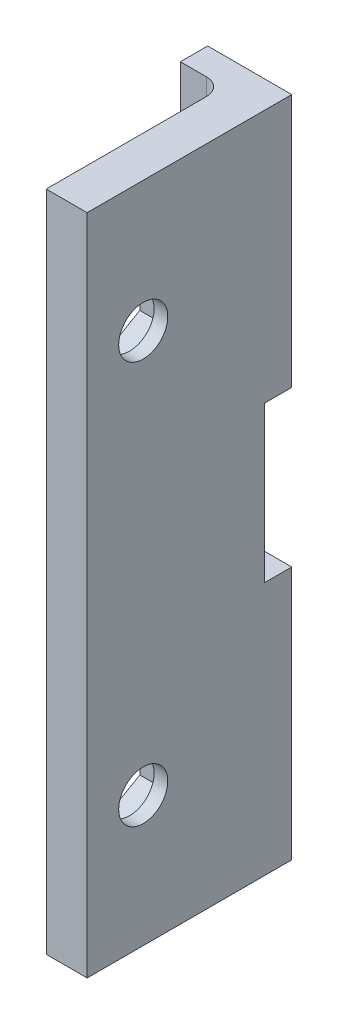
ISO-10303-21;
HEADER;
FILE_DESCRIPTION(('STEP AP214'),'2;1');
FILE_NAME('part.step','',(''),(''),'','','');
FILE_SCHEMA(('AUTOMOTIVE_DESIGN { 1 0 10303 214 1 1 1 1 }'));
ENDSEC;
DATA;
#1=APPLICATION_CONTEXT('core data for automotive mechanical design processes');
#2=APPLICATION_PROTOCOL_DEFINITION('international standard','automotive_design',2000,#1);
#3=PRODUCT_CONTEXT('',#1,'mechanical');
#4=PRODUCT('Part','Part','',(#3));
#5=PRODUCT_RELATED_PRODUCT_CATEGORY('part','',(#4));
#6=PRODUCT_DEFINITION_FORMATION('','',#4);
#7=PRODUCT_DEFINITION_CONTEXT('part definition',#1,'design');
#8=PRODUCT_DEFINITION('design','',#6,#7);
#9=PRODUCT_DEFINITION_SHAPE('','',#8);
#10=(LENGTH_UNIT() NAMED_UNIT(*) SI_UNIT(.MILLI.,.METRE.));
#11=(NAMED_UNIT(*) PLANE_ANGLE_UNIT() SI_UNIT($,.RADIAN.));
#12=(NAMED_UNIT(*) SI_UNIT($,.STERADIAN.) SOLID_ANGLE_UNIT());
#13=UNCERTAINTY_MEASURE_WITH_UNIT(LENGTH_MEASURE(1.E-05),#10,'distance_accuracy_value','');
#14=(GEOMETRIC_REPRESENTATION_CONTEXT(3) GLOBAL_UNCERTAINTY_ASSIGNED_CONTEXT((#13)) GLOBAL_UNIT_ASSIGNED_CONTEXT((#10,
#11,#12)) REPRESENTATION_CONTEXT('',''));
#15=CARTESIAN_POINT('',(0.,0.,0.));
#16=DIRECTION('',(0.,0.,1.));
#17=DIRECTION('',(1.,0.,0.));
#18=AXIS2_PLACEMENT_3D('',#15,#16,#17);
#19=CARTESIAN_POINT('',(-7.0907233274792,-18.712787821733,26.2114356711207));
#20=DIRECTION('',(1.,0.,0.));
#21=DIRECTION('',(0.,0.,-1.));
#22=AXIS2_PLACEMENT_3D('',#19,#20,#21);
#23=PLANE('',#22);
#24=DIRECTION('',(0.,-0.499999999999998,-0.86602540378444));
#25=VECTOR('',#24,1.);
#26=CARTESIAN_POINT('',(-7.0907233274792,-28.3856483612441,16.3884617224863));
#27=LINE('',#26,#25);
#28=CARTESIAN_POINT('',(-7.0907233274792,-25.0873613411899,22.1012624191652));
#29=VERTEX_POINT('',#28);
#30=CARTESIAN_POINT('',(-7.0907233274792,-26.6750745814614,19.3512624191652));
#31=VERTEX_POINT('',#30);
#32=EDGE_CURVE('E267',#29,#31,#27,.T.);
#33=ORIENTED_EDGE('',*,*,#32,.F.);
#34=DIRECTION('',(0.,0.500000000000002,-0.866025403784438));
#35=VECTOR('',#34,1.);
#36=CARTESIAN_POINT('',(-7.0907233274792,-9.24539365054068,-5.33783051290375));
#37=LINE('',#36,#35);
#38=CARTESIAN_POINT('',(-7.0907233274792,-26.6750745814614,24.8512624191652));
#39=VERTEX_POINT('',#38);
#40=EDGE_CURVE('E61',#39,#29,#37,.T.);
#41=ORIENTED_EDGE('',*,*,#40,.F.);
#42=DIRECTION('',(0.,1.,0.));
#43=VECTOR('',#42,1.);
#44=CARTESIAN_POINT('',(-7.0907233274792,0.,24.8512624191652));
#45=LINE('',#44,#43);
#46=CARTESIAN_POINT('',(-7.0907233274792,-29.8505010620043,24.8512624191652));
#47=VERTEX_POINT('',#46);
#48=EDGE_CURVE('E244',#47,#39,#45,.T.);
#49=ORIENTED_EDGE('',*,*,#48,.F.);
#50=DIRECTION('',(0.,0.5,0.866025403784439));
#51=VECTOR('',#50,1.);
#52=CARTESIAN_POINT('',(-7.0907233274792,-33.1487880820585,19.1384617224863));
#53=LINE('',#52,#51);
#54=CARTESIAN_POINT('',(-7.0907233274792,-31.4382143022758,22.1012624191652));
#55=VERTEX_POINT('',#54);
#56=EDGE_CURVE('E248',#55,#47,#53,.T.);
#57=ORIENTED_EDGE('',*,*,#56,.F.);
#58=DIRECTION('',(0.,-0.500000000000003,0.866025403784437));
#59=VECTOR('',#58,1.);
#60=CARTESIAN_POINT('',(-7.0907233274792,-14.0085333713551,-8.08783051290376));
#61=LINE('',#60,#59);
#62=CARTESIAN_POINT('',(-7.0907233274792,-29.8505010620043,19.3512624191652));
#63=VERTEX_POINT('',#62);
#64=EDGE_CURVE('E275',#63,#55,#61,.T.);
#65=ORIENTED_EDGE('',*,*,#64,.F.);
#66=DIRECTION('',(0.,-1.,0.));
#67=VECTOR('',#66,1.);
#68=CARTESIAN_POINT('',(-7.0907233274792,0.,19.3512624191652));
#69=LINE('',#68,#67);
#70=EDGE_CURVE('E271',#31,#63,#69,.T.);
#71=ORIENTED_EDGE('',*,*,#70,.F.);
#72=EDGE_LOOP('',(#33,#41,#49,#57,#65,#71));
#73=FACE_BOUND('',#72,.T.);
#74=DIRECTION('',(0.,0.,-1.));
#75=VECTOR('',#74,1.);
#76=CARTESIAN_POINT('',(-7.0907233274792,-18.712787821733,26.2114356711207));
#77=LINE('',#76,#75);
#78=CARTESIAN_POINT('',(-7.0907233274792,-18.712787821733,26.2114356711207));
#79=VERTEX_POINT('',#78);
#80=CARTESIAN_POINT('',(-7.0907233274792,-18.712787821733,14.4614356711207));
#81=VERTEX_POINT('',#80);
#82=EDGE_CURVE('E408',#79,#81,#77,.T.);
#83=ORIENTED_EDGE('',*,*,#82,.T.);
#84=DIRECTION('',(0.,-1.,0.));
#85=VECTOR('',#84,1.);
#86=CARTESIAN_POINT('',(-7.0907233274792,-37.312787821733,14.4614356711207));
#87=LINE('',#86,#85);
#88=CARTESIAN_POINT('',(-7.0907233274792,-37.312787821733,14.4614356711207));
#89=VERTEX_POINT('',#88);
#90=EDGE_CURVE('E478',#81,#89,#87,.T.);
#91=ORIENTED_EDGE('',*,*,#90,.T.);
#92=DIRECTION('',(0.,0.,-1.));
#93=VECTOR('',#92,1.);
#94=CARTESIAN_POINT('',(-7.0907233274792,-37.312787821733,13.2114356711207));
#95=LINE('',#94,#93);
#96=CARTESIAN_POINT('',(-7.0907233274792,-37.312787821733,13.2114356711207));
#97=VERTEX_POINT('',#96);
#98=EDGE_CURVE('E475',#89,#97,#95,.T.);
#99=ORIENTED_EDGE('',*,*,#98,.T.);
#100=DIRECTION('',(0.,-1.,0.));
#101=VECTOR('',#100,1.);
#102=CARTESIAN_POINT('',(-7.0907233274792,-18.712787821733,13.2114356711207));
#103=LINE('',#102,#101);
#104=CARTESIAN_POINT('',(-7.0907233274792,-48.712787821733,13.2114356711207));
#105=VERTEX_POINT('',#104);
#106=EDGE_CURVE('E392',#97,#105,#103,.T.);
#107=ORIENTED_EDGE('',*,*,#106,.T.);
#108=DIRECTION('',(0.,0.,1.));
#109=VECTOR('',#108,1.);
#110=CARTESIAN_POINT('',(-7.0907233274792,-48.712787821733,13.2114356711207));
#111=LINE('',#110,#109);
#112=CARTESIAN_POINT('',(-7.0907233274792,-48.712787821733,14.4614356711207));
#113=VERTEX_POINT('',#112);
#114=EDGE_CURVE('E456',#105,#113,#111,.T.);
#115=ORIENTED_EDGE('',*,*,#114,.T.);
#116=DIRECTION('',(0.,-1.,0.));
#117=VECTOR('',#116,1.);
#118=CARTESIAN_POINT('',(-7.0907233274792,-18.712787821733,14.4614356711207));
#119=LINE('',#118,#117);
#120=CARTESIAN_POINT('',(-7.0907233274792,-67.312787821733,14.4614356711207));
#121=VERTEX_POINT('',#120);
#122=EDGE_CURVE('E471',#113,#121,#119,.T.);
#123=ORIENTED_EDGE('',*,*,#122,.T.);
#124=DIRECTION('',(0.,0.,-1.));
#125=VECTOR('',#124,1.);
#126=CARTESIAN_POINT('',(-7.0907233274792,-67.312787821733,26.2114356711207));
#127=LINE('',#126,#125);
#128=CARTESIAN_POINT('',(-7.0907233274792,-67.312787821733,26.2114356711207));
#129=VERTEX_POINT('',#128);
#130=EDGE_CURVE('E421',#129,#121,#127,.T.);
#131=ORIENTED_EDGE('',*,*,#130,.F.);
#132=DIRECTION('',(0.,-1.,0.));
#133=VECTOR('',#132,1.);
#134=CARTESIAN_POINT('',(-7.0907233274792,-18.712787821733,26.2114356711207));
#135=LINE('',#134,#133);
#136=EDGE_CURVE('E393',#79,#129,#135,.T.);
#137=ORIENTED_EDGE('',*,*,#136,.F.);
#138=EDGE_LOOP('',(#83,#91,#99,#107,#115,#123,#131,#137));
#139=FACE_BOUND('',#138,.T.);
#140=DIRECTION('',(0.,-0.5,-0.866025403784439));
#141=VECTOR('',#140,1.);
#142=CARTESIAN_POINT('',(-7.0907233274792,-55.2737880820587,31.9123364283069));
#143=LINE('',#142,#141);
#144=CARTESIAN_POINT('',(-7.0907233274792,-59.3505010620046,24.8512624191651));
#145=VERTEX_POINT('',#144);
#146=CARTESIAN_POINT('',(-7.0907233274792,-60.9382143022761,22.1012624191651));
#147=VERTEX_POINT('',#146);
#148=EDGE_CURVE('E69',#145,#147,#143,.T.);
#149=ORIENTED_EDGE('',*,*,#148,.T.);
#150=DIRECTION('',(0.,0.5,-0.866025403784439));
#151=VECTOR('',#150,1.);
#152=CARTESIAN_POINT('',(-7.0907233274792,-36.1335333713554,-20.8617052187244));
#153=LINE('',#152,#151);
#154=CARTESIAN_POINT('',(-7.0907233274792,-59.3505010620046,19.3512624191651));
#155=VERTEX_POINT('',#154);
#156=EDGE_CURVE('E302',#147,#155,#153,.T.);
#157=ORIENTED_EDGE('',*,*,#156,.T.);
#158=DIRECTION('',(0.,1.,0.));
#159=VECTOR('',#158,1.);
#160=CARTESIAN_POINT('',(-7.0907233274792,0.,19.3512624191651));
#161=LINE('',#160,#159);
#162=CARTESIAN_POINT('',(-7.0907233274792,-56.1750745814617,19.3512624191651));
#163=VERTEX_POINT('',#162);
#164=EDGE_CURVE('E332',#155,#163,#161,.T.);
#165=ORIENTED_EDGE('',*,*,#164,.T.);
#166=DIRECTION('',(0.,0.5,0.866025403784438));
#167=VECTOR('',#166,1.);
#168=CARTESIAN_POINT('',(-7.0907233274792,-50.5106483612443,29.162336428307));
#169=LINE('',#168,#167);
#170=CARTESIAN_POINT('',(-7.0907233274792,-54.5873613411902,22.1012624191651));
#171=VERTEX_POINT('',#170);
#172=EDGE_CURVE('E328',#163,#171,#169,.T.);
#173=ORIENTED_EDGE('',*,*,#172,.T.);
#174=DIRECTION('',(0.,-0.500000000000001,0.866025403784438));
#175=VECTOR('',#174,1.);
#176=CARTESIAN_POINT('',(-7.0907233274792,-31.3703936505409,-18.1117052187244));
#177=LINE('',#176,#175);
#178=CARTESIAN_POINT('',(-7.0907233274792,-56.1750745814617,24.8512624191651));
#179=VERTEX_POINT('',#178);
#180=EDGE_CURVE('E324',#171,#179,#177,.T.);
#181=ORIENTED_EDGE('',*,*,#180,.T.);
#182=DIRECTION('',(0.,-1.,0.));
#183=VECTOR('',#182,1.);
#184=CARTESIAN_POINT('',(-7.0907233274792,0.,24.8512624191651));
#185=LINE('',#184,#183);
#186=EDGE_CURVE('E320',#179,#145,#185,.T.);
#187=ORIENTED_EDGE('',*,*,#186,.T.);
#188=EDGE_LOOP('',(#149,#157,#165,#173,#181,#187));
#189=FACE_BOUND('',#188,.T.);
#190=ADVANCED_FACE('F45',(#73,#139,#189),#23,.F.);
#191=CARTESIAN_POINT('',(0.,0.,13.2114356711207));
#192=DIRECTION('',(0.,0.,1.));
#193=DIRECTION('',(1.,0.,0.));
#194=AXIS2_PLACEMENT_3D('',#191,#192,#193);
#195=PLANE('',#194);
#196=DIRECTION('',(1.,0.,0.));
#197=VECTOR('',#196,1.);
#198=CARTESIAN_POINT('',(-10.2569733274792,-37.312787821733,13.2114356711207));
#199=LINE('',#198,#197);
#200=CARTESIAN_POINT('',(-4.0907233274792,-37.312787821733,13.2114356711207));
#201=VERTEX_POINT('',#200);
#202=EDGE_CURVE('E359',#97,#201,#199,.T.);
#203=ORIENTED_EDGE('',*,*,#202,.T.);
#204=DIRECTION('',(0.,1.,0.));
#205=VECTOR('',#204,1.);
#206=CARTESIAN_POINT('',(-4.0907233274792,-18.712787821733,13.2114356711207));
#207=LINE('',#206,#205);
#208=CARTESIAN_POINT('',(-4.09072332747922,-48.712787821733,13.2114356711207));
#209=VERTEX_POINT('',#208);
#210=EDGE_CURVE('E398',#209,#201,#207,.T.);
#211=ORIENTED_EDGE('',*,*,#210,.F.);
#212=DIRECTION('',(-1.,0.,0.));
#213=VECTOR('',#212,1.);
#214=CARTESIAN_POINT('',(-10.2569733274792,-48.712787821733,13.2114356711207));
#215=LINE('',#214,#213);
#216=EDGE_CURVE('E457',#209,#105,#215,.T.);
#217=ORIENTED_EDGE('',*,*,#216,.T.);
#218=ORIENTED_EDGE('',*,*,#106,.F.);
#219=EDGE_LOOP('',(#203,#211,#217,#218));
#220=FACE_BOUND('',#219,.T.);
#221=ADVANCED_FACE('F518',(#220),#195,.F.);
#222=CARTESIAN_POINT('',(-10.2569733274792,-48.712787821733,13.2114356711207));
#223=DIRECTION('',(1.,0.,0.));
#224=DIRECTION('',(0.,1.,0.));
#225=AXIS2_PLACEMENT_3D('',#222,#223,#224);
#226=PLANE('',#225);
#227=DIRECTION('',(0.,-1.,0.));
#228=VECTOR('',#227,1.);
#229=CARTESIAN_POINT('',(-10.2569733274792,-48.712787821733,11.2114356711207));
#230=LINE('',#229,#228);
#231=CARTESIAN_POINT('',(-10.2569733274792,-48.712787821733,11.2114356711207));
#232=VERTEX_POINT('',#231);
#233=CARTESIAN_POINT('',(-10.2569733274793,-67.312787821733,11.2114356711207));
#234=VERTEX_POINT('',#233);
#235=EDGE_CURVE('E452',#232,#234,#230,.T.);
#236=ORIENTED_EDGE('',*,*,#235,.T.);
#237=DIRECTION('',(0.,0.,-1.));
#238=VECTOR('',#237,1.);
#239=CARTESIAN_POINT('',(-10.2569733274793,-67.312787821733,13.2114356711207));
#240=LINE('',#239,#238);
#241=CARTESIAN_POINT('',(-10.2569733274793,-67.312787821733,13.2114356711207));
#242=VERTEX_POINT('',#241);
#243=EDGE_CURVE('E425',#242,#234,#240,.T.);
#244=ORIENTED_EDGE('',*,*,#243,.F.);
#245=DIRECTION('',(0.,-1.,0.));
#246=VECTOR('',#245,1.);
#247=CARTESIAN_POINT('',(-10.2569733274792,-48.712787821733,13.2114356711207));
#248=LINE('',#247,#246);
#249=CARTESIAN_POINT('',(-10.2569733274792,-48.712787821733,13.2114356711207));
#250=VERTEX_POINT('',#249);
#251=EDGE_CURVE('E446',#250,#242,#248,.T.);
#252=ORIENTED_EDGE('',*,*,#251,.F.);
#253=DIRECTION('',(0.,0.,-1.));
#254=VECTOR('',#253,1.);
#255=CARTESIAN_POINT('',(-10.2569733274792,-48.712787821733,13.2114356711207));
#256=LINE('',#255,#254);
#257=EDGE_CURVE('E437',#250,#232,#256,.T.);
#258=ORIENTED_EDGE('',*,*,#257,.T.);
#259=EDGE_LOOP('',(#236,#244,#252,#258));
#260=FACE_BOUND('',#259,.T.);
#261=ADVANCED_FACE('F526',(#260),#226,.F.);
#262=CARTESIAN_POINT('',(-10.2569733274793,-67.312787821733,13.2114356711207));
#263=DIRECTION('',(0.,1.,0.));
#264=DIRECTION('',(-1.,0.,0.));
#265=AXIS2_PLACEMENT_3D('',#262,#263,#264);
#266=PLANE('',#265);
#267=DIRECTION('',(1.,0.,0.));
#268=VECTOR('',#267,1.);
#269=CARTESIAN_POINT('',(-10.2569733274793,-67.312787821733,11.2114356711207));
#270=LINE('',#269,#268);
#271=CARTESIAN_POINT('',(-4.09072332747927,-67.312787821733,11.2114356711207));
#272=VERTEX_POINT('',#271);
#273=EDGE_CURVE('E449',#234,#272,#270,.T.);
#274=ORIENTED_EDGE('',*,*,#273,.T.);
#275=DIRECTION('',(0.,0.,-1.));
#276=VECTOR('',#275,1.);
#277=CARTESIAN_POINT('',(-4.09072332747927,-67.312787821733,13.2114356711207));
#278=LINE('',#277,#276);
#279=CARTESIAN_POINT('',(-4.0907233274792,-67.312787821733,26.2114356711207));
#280=VERTEX_POINT('',#279);
#281=EDGE_CURVE('E429',#280,#272,#278,.T.);
#282=ORIENTED_EDGE('',*,*,#281,.F.);
#283=DIRECTION('',(1.,0.,0.));
#284=VECTOR('',#283,1.);
#285=CARTESIAN_POINT('',(-7.0907233274792,-67.312787821733,26.2114356711207));
#286=LINE('',#285,#284);
#287=EDGE_CURVE('E397',#129,#280,#286,.T.);
#288=ORIENTED_EDGE('',*,*,#287,.F.);
#289=ORIENTED_EDGE('',*,*,#130,.T.);
#290=CARTESIAN_POINT('',(-8.3407233274792,-67.312787821733,14.4614356711207));
#291=DIRECTION('',(0.,1.,0.));
#292=DIRECTION('',(-1.,0.,0.));
#293=AXIS2_PLACEMENT_3D('',#290,#291,#292);
#294=CIRCLE('',#293,1.25);
#295=CARTESIAN_POINT('',(-8.3407233274792,-67.312787821733,13.2114356711207));
#296=VERTEX_POINT('',#295);
#297=EDGE_CURVE('E54',#121,#296,#294,.T.);
#298=ORIENTED_EDGE('',*,*,#297,.T.);
#299=DIRECTION('',(1.,0.,0.));
#300=VECTOR('',#299,1.);
#301=CARTESIAN_POINT('',(-10.2569733274793,-67.312787821733,13.2114356711207));
#302=LINE('',#301,#300);
#303=EDGE_CURVE('E461',#242,#296,#302,.T.);
#304=ORIENTED_EDGE('',*,*,#303,.F.);
#305=ORIENTED_EDGE('',*,*,#243,.T.);
#306=EDGE_LOOP('',(#274,#282,#288,#289,#298,#304,#305));
#307=FACE_BOUND('',#306,.T.);
#308=ADVANCED_FACE('F495',(#307),#266,.F.);
#309=CARTESIAN_POINT('',(-4.09072332747922,-48.712787821733,13.2114356711207));
#310=DIRECTION('',(-1.,0.,0.));
#311=DIRECTION('',(0.,-1.,0.));
#312=AXIS2_PLACEMENT_3D('',#309,#310,#311);
#313=PLANE('',#312);
#314=CARTESIAN_POINT('',(-4.0907233274792,-57.7627878217332,22.1012624191651));
#315=DIRECTION('',(-1.,0.,0.));
#316=DIRECTION('',(0.,0.,1.));
#317=AXIS2_PLACEMENT_3D('',#314,#315,#316);
#318=CIRCLE('',#317,1.8);
#319=CARTESIAN_POINT('',(-4.0907233274792,-57.7627878217332,23.9012624191651));
#320=VERTEX_POINT('',#319);
#321=EDGE_CURVE('E858',#320,#320,#318,.T.);
#322=ORIENTED_EDGE('',*,*,#321,.T.);
#323=EDGE_LOOP('',(#322));
#324=FACE_BOUND('',#323,.T.);
#325=CARTESIAN_POINT('',(-4.0907233274792,-28.2627878217329,22.1012624191651));
#326=DIRECTION('',(-1.,0.,0.));
#327=DIRECTION('',(0.,0.,1.));
#328=AXIS2_PLACEMENT_3D('',#325,#326,#327);
#329=CIRCLE('',#328,1.8);
#330=CARTESIAN_POINT('',(-4.0907233274792,-28.2627878217329,23.9012624191651));
#331=VERTEX_POINT('',#330);
#332=EDGE_CURVE('E862',#331,#331,#329,.T.);
#333=ORIENTED_EDGE('',*,*,#332,.T.);
#334=EDGE_LOOP('',(#333));
#335=FACE_BOUND('',#334,.T.);
#336=DIRECTION('',(0.,1.,0.));
#337=VECTOR('',#336,1.);
#338=CARTESIAN_POINT('',(-4.09072332747922,-48.712787821733,11.2114356711207));
#339=LINE('',#338,#337);
#340=CARTESIAN_POINT('',(-4.09072332747922,-48.712787821733,11.2114356711207));
#341=VERTEX_POINT('',#340);
#342=EDGE_CURVE('E445',#272,#341,#339,.T.);
#343=ORIENTED_EDGE('',*,*,#342,.T.);
#344=DIRECTION('',(0.,0.,-1.));
#345=VECTOR('',#344,1.);
#346=CARTESIAN_POINT('',(-4.09072332747922,-48.712787821733,13.2114356711207));
#347=LINE('',#346,#345);
#348=EDGE_CURVE('E433',#209,#341,#347,.T.);
#349=ORIENTED_EDGE('',*,*,#348,.F.);
#350=ORIENTED_EDGE('',*,*,#210,.T.);
#351=DIRECTION('',(0.,0.,-1.));
#352=VECTOR('',#351,1.);
#353=CARTESIAN_POINT('',(-4.0907233274792,-37.312787821733,13.2114356711207));
#354=LINE('',#353,#352);
#355=CARTESIAN_POINT('',(-4.0907233274792,-37.312787821733,11.2114356711207));
#356=VERTEX_POINT('',#355);
#357=EDGE_CURVE('E384',#201,#356,#354,.T.);
#358=ORIENTED_EDGE('',*,*,#357,.T.);
#359=DIRECTION('',(0.,1.,0.));
#360=VECTOR('',#359,1.);
#361=CARTESIAN_POINT('',(-4.0907233274792,-37.312787821733,11.2114356711207));
#362=LINE('',#361,#360);
#363=CARTESIAN_POINT('',(-4.0907233274792,-18.712787821733,11.2114356711207));
#364=VERTEX_POINT('',#363);
#365=EDGE_CURVE('E375',#356,#364,#362,.T.);
#366=ORIENTED_EDGE('',*,*,#365,.T.);
#367=DIRECTION('',(0.,0.,-1.));
#368=VECTOR('',#367,1.);
#369=CARTESIAN_POINT('',(-4.0907233274792,-18.712787821733,26.2114356711207));
#370=LINE('',#369,#368);
#371=CARTESIAN_POINT('',(-4.0907233274792,-18.712787821733,26.2114356711207));
#372=VERTEX_POINT('',#371);
#373=EDGE_CURVE('E418',#372,#364,#370,.T.);
#374=ORIENTED_EDGE('',*,*,#373,.F.);
#375=DIRECTION('',(0.,1.,0.));
#376=VECTOR('',#375,1.);
#377=CARTESIAN_POINT('',(-4.0907233274792,-18.712787821733,26.2114356711207));
#378=LINE('',#377,#376);
#379=EDGE_CURVE('E402',#280,#372,#378,.T.);
#380=ORIENTED_EDGE('',*,*,#379,.F.);
#381=ORIENTED_EDGE('',*,*,#281,.T.);
#382=EDGE_LOOP('',(#343,#349,#350,#358,#366,#374,#380,#381));
#383=FACE_BOUND('',#382,.T.);
#384=ADVANCED_FACE('F528',(#324,#335,#383),#313,.F.);
#385=CARTESIAN_POINT('',(-10.2569733274792,-48.712787821733,13.2114356711207));
#386=DIRECTION('',(0.,-1.,0.));
#387=DIRECTION('',(1.,0.,0.));
#388=AXIS2_PLACEMENT_3D('',#385,#386,#387);
#389=PLANE('',#388);
#390=DIRECTION('',(-1.,0.,0.));
#391=VECTOR('',#390,1.);
#392=CARTESIAN_POINT('',(-10.2569733274792,-48.712787821733,11.2114356711207));
#393=LINE('',#392,#391);
#394=EDGE_CURVE('E442',#341,#232,#393,.T.);
#395=ORIENTED_EDGE('',*,*,#394,.T.);
#396=ORIENTED_EDGE('',*,*,#257,.F.);
#397=CARTESIAN_POINT('',(-8.3407233274792,-48.712787821733,13.2114356711207));
#398=VERTEX_POINT('',#397);
#399=EDGE_CURVE('E441',#398,#250,#215,.T.);
#400=ORIENTED_EDGE('',*,*,#399,.F.);
#401=CARTESIAN_POINT('',(-8.3407233274792,-48.712787821733,14.4614356711207));
#402=DIRECTION('',(0.,-1.,0.));
#403=DIRECTION('',(1.,0.,0.));
#404=AXIS2_PLACEMENT_3D('',#401,#402,#403);
#405=CIRCLE('',#404,1.25);
#406=EDGE_CURVE('E11',#398,#113,#405,.T.);
#407=ORIENTED_EDGE('',*,*,#406,.T.);
#408=ORIENTED_EDGE('',*,*,#114,.F.);
#409=ORIENTED_EDGE('',*,*,#216,.F.);
#410=ORIENTED_EDGE('',*,*,#348,.T.);
#411=EDGE_LOOP('',(#395,#396,#400,#407,#408,#409,#410));
#412=FACE_BOUND('',#411,.T.);
#413=ADVANCED_FACE('F507',(#412),#389,.F.);
#414=CARTESIAN_POINT('',(0.,0.,13.2114356711207));
#415=DIRECTION('',(0.,0.,1.));
#416=DIRECTION('',(1.,0.,0.));
#417=AXIS2_PLACEMENT_3D('',#414,#415,#416);
#418=PLANE('',#417);
#419=ORIENTED_EDGE('',*,*,#303,.T.);
#420=DIRECTION('',(0.,-1.,0.));
#421=VECTOR('',#420,1.);
#422=CARTESIAN_POINT('',(-8.3407233274792,0.,13.2114356711207));
#423=LINE('',#422,#421);
#424=EDGE_CURVE('E485',#296,#398,#423,.F.);
#425=ORIENTED_EDGE('',*,*,#424,.T.);
#426=ORIENTED_EDGE('',*,*,#399,.T.);
#427=ORIENTED_EDGE('',*,*,#251,.T.);
#428=EDGE_LOOP('',(#419,#425,#426,#427));
#429=FACE_BOUND('',#428,.T.);
#430=ADVANCED_FACE('F501',(#429),#418,.T.);
#431=CARTESIAN_POINT('',(0.,0.,11.2114356711207));
#432=DIRECTION('',(0.,0.,1.));
#433=DIRECTION('',(1.,0.,0.));
#434=AXIS2_PLACEMENT_3D('',#431,#432,#433);
#435=PLANE('',#434);
#436=ORIENTED_EDGE('',*,*,#235,.F.);
#437=ORIENTED_EDGE('',*,*,#394,.F.);
#438=ORIENTED_EDGE('',*,*,#342,.F.);
#439=ORIENTED_EDGE('',*,*,#273,.F.);
#440=EDGE_LOOP('',(#436,#437,#438,#439));
#441=FACE_BOUND('',#440,.T.);
#442=ADVANCED_FACE('F524',(#441),#435,.F.);
#443=CARTESIAN_POINT('',(-7.0907233274792,-18.712787821733,26.2114356711207));
#444=DIRECTION('',(0.,-1.,0.));
#445=DIRECTION('',(0.,0.,-1.));
#446=AXIS2_PLACEMENT_3D('',#443,#444,#445);
#447=PLANE('',#446);
#448=ORIENTED_EDGE('',*,*,#373,.T.);
#449=DIRECTION('',(-1.,0.,0.));
#450=VECTOR('',#449,1.);
#451=CARTESIAN_POINT('',(-10.2569733274792,-18.712787821733,11.2114356711207));
#452=LINE('',#451,#450);
#453=CARTESIAN_POINT('',(-10.2569733274792,-18.712787821733,11.2114356711207));
#454=VERTEX_POINT('',#453);
#455=EDGE_CURVE('E360',#364,#454,#452,.T.);
#456=ORIENTED_EDGE('',*,*,#455,.T.);
#457=DIRECTION('',(0.,0.,-1.));
#458=VECTOR('',#457,1.);
#459=CARTESIAN_POINT('',(-10.2569733274792,-18.712787821733,13.2114356711207));
#460=LINE('',#459,#458);
#461=CARTESIAN_POINT('',(-10.2569733274792,-18.712787821733,13.2114356711207));
#462=VERTEX_POINT('',#461);
#463=EDGE_CURVE('E368',#462,#454,#460,.T.);
#464=ORIENTED_EDGE('',*,*,#463,.F.);
#465=DIRECTION('',(-1.,0.,0.));
#466=VECTOR('',#465,1.);
#467=CARTESIAN_POINT('',(-10.2569733274792,-18.712787821733,13.2114356711207));
#468=LINE('',#467,#466);
#469=CARTESIAN_POINT('',(-8.3407233274792,-18.712787821733,13.2114356711207));
#470=VERTEX_POINT('',#469);
#471=EDGE_CURVE('E365',#470,#462,#468,.T.);
#472=ORIENTED_EDGE('',*,*,#471,.F.);
#473=CARTESIAN_POINT('',(-8.3407233274792,-18.712787821733,14.4614356711207));
#474=DIRECTION('',(0.,-1.,0.));
#475=DIRECTION('',(0.,0.,-1.));
#476=AXIS2_PLACEMENT_3D('',#473,#474,#475);
#477=CIRCLE('',#476,1.25);
#478=EDGE_CURVE('E491',#470,#81,#477,.T.);
#479=ORIENTED_EDGE('',*,*,#478,.T.);
#480=ORIENTED_EDGE('',*,*,#82,.F.);
#481=DIRECTION('',(-1.,0.,0.));
#482=VECTOR('',#481,1.);
#483=CARTESIAN_POINT('',(-7.0907233274792,-18.712787821733,26.2114356711207));
#484=LINE('',#483,#482);
#485=EDGE_CURVE('E405',#372,#79,#484,.T.);
#486=ORIENTED_EDGE('',*,*,#485,.F.);
#487=EDGE_LOOP('',(#448,#456,#464,#472,#479,#480,#486));
#488=FACE_BOUND('',#487,.T.);
#489=ADVANCED_FACE('F551',(#488),#447,.F.);
#490=CARTESIAN_POINT('',(0.,0.,26.2114356711207));
#491=DIRECTION('',(0.,0.,1.));
#492=DIRECTION('',(1.,0.,0.));
#493=AXIS2_PLACEMENT_3D('',#490,#491,#492);
#494=PLANE('',#493);
#495=ORIENTED_EDGE('',*,*,#136,.T.);
#496=ORIENTED_EDGE('',*,*,#287,.T.);
#497=ORIENTED_EDGE('',*,*,#379,.T.);
#498=ORIENTED_EDGE('',*,*,#485,.T.);
#499=EDGE_LOOP('',(#495,#496,#497,#498));
#500=FACE_BOUND('',#499,.T.);
#501=ADVANCED_FACE('F532',(#500),#494,.T.);
#502=CARTESIAN_POINT('',(0.,0.,13.2114356711207));
#503=DIRECTION('',(0.,0.,-1.));
#504=DIRECTION('',(-1.,0.,0.));
#505=AXIS2_PLACEMENT_3D('',#502,#503,#504);
#506=PLANE('',#505);
#507=CARTESIAN_POINT('',(-10.2569733274792,-37.312787821733,13.2114356711207));
#508=VERTEX_POINT('',#507);
#509=CARTESIAN_POINT('',(-8.3407233274792,-37.312787821733,13.2114356711207));
#510=VERTEX_POINT('',#509);
#511=EDGE_CURVE('E361',#508,#510,#199,.T.);
#512=ORIENTED_EDGE('',*,*,#511,.T.);
#513=DIRECTION('',(0.,-1.,0.));
#514=VECTOR('',#513,1.);
#515=CARTESIAN_POINT('',(-8.3407233274792,-18.712787821733,13.2114356711207));
#516=LINE('',#515,#514);
#517=EDGE_CURVE('E482',#510,#470,#516,.F.);
#518=ORIENTED_EDGE('',*,*,#517,.T.);
#519=ORIENTED_EDGE('',*,*,#471,.T.);
#520=DIRECTION('',(0.,-1.,0.));
#521=VECTOR('',#520,1.);
#522=CARTESIAN_POINT('',(-10.2569733274792,-37.312787821733,13.2114356711207));
#523=LINE('',#522,#521);
#524=EDGE_CURVE('E355',#462,#508,#523,.T.);
#525=ORIENTED_EDGE('',*,*,#524,.T.);
#526=EDGE_LOOP('',(#512,#518,#519,#525));
#527=FACE_BOUND('',#526,.T.);
#528=ADVANCED_FACE('F558',(#527),#506,.F.);
#529=CARTESIAN_POINT('',(-10.2569733274792,-37.312787821733,13.2114356711207));
#530=DIRECTION('',(1.,0.,0.));
#531=DIRECTION('',(0.,0.,-1.));
#532=AXIS2_PLACEMENT_3D('',#529,#530,#531);
#533=PLANE('',#532);
#534=DIRECTION('',(0.,-1.,0.));
#535=VECTOR('',#534,1.);
#536=CARTESIAN_POINT('',(-10.2569733274792,-37.312787821733,11.2114356711207));
#537=LINE('',#536,#535);
#538=CARTESIAN_POINT('',(-10.2569733274792,-37.312787821733,11.2114356711207));
#539=VERTEX_POINT('',#538);
#540=EDGE_CURVE('E285',#454,#539,#537,.T.);
#541=ORIENTED_EDGE('',*,*,#540,.T.);
#542=DIRECTION('',(0.,0.,-1.));
#543=VECTOR('',#542,1.);
#544=CARTESIAN_POINT('',(-10.2569733274792,-37.312787821733,13.2114356711207));
#545=LINE('',#544,#543);
#546=EDGE_CURVE('E388',#508,#539,#545,.T.);
#547=ORIENTED_EDGE('',*,*,#546,.F.);
#548=ORIENTED_EDGE('',*,*,#524,.F.);
#549=ORIENTED_EDGE('',*,*,#463,.T.);
#550=EDGE_LOOP('',(#541,#547,#548,#549));
#551=FACE_BOUND('',#550,.T.);
#552=ADVANCED_FACE('F555',(#551),#533,.F.);
#553=CARTESIAN_POINT('',(-10.2569733274792,-37.312787821733,13.2114356711207));
#554=DIRECTION('',(0.,1.,0.));
#555=DIRECTION('',(0.,0.,1.));
#556=AXIS2_PLACEMENT_3D('',#553,#554,#555);
#557=PLANE('',#556);
#558=DIRECTION('',(1.,0.,0.));
#559=VECTOR('',#558,1.);
#560=CARTESIAN_POINT('',(-10.2569733274792,-37.312787821733,11.2114356711207));
#561=LINE('',#560,#559);
#562=EDGE_CURVE('E372',#539,#356,#561,.T.);
#563=ORIENTED_EDGE('',*,*,#562,.T.);
#564=ORIENTED_EDGE('',*,*,#357,.F.);
#565=ORIENTED_EDGE('',*,*,#202,.F.);
#566=ORIENTED_EDGE('',*,*,#98,.F.);
#567=CARTESIAN_POINT('',(-8.3407233274792,-37.312787821733,14.4614356711207));
#568=DIRECTION('',(0.,1.,0.));
#569=DIRECTION('',(0.,0.,1.));
#570=AXIS2_PLACEMENT_3D('',#567,#568,#569);
#571=CIRCLE('',#570,1.25);
#572=EDGE_CURVE('E488',#89,#510,#571,.T.);
#573=ORIENTED_EDGE('',*,*,#572,.T.);
#574=ORIENTED_EDGE('',*,*,#511,.F.);
#575=ORIENTED_EDGE('',*,*,#546,.T.);
#576=EDGE_LOOP('',(#563,#564,#565,#566,#573,#574,#575));
#577=FACE_BOUND('',#576,.T.);
#578=ADVANCED_FACE('F542',(#577),#557,.F.);
#579=CARTESIAN_POINT('',(0.,0.,11.2114356711207));
#580=DIRECTION('',(0.,0.,-1.));
#581=DIRECTION('',(-1.,0.,0.));
#582=AXIS2_PLACEMENT_3D('',#579,#580,#581);
#583=PLANE('',#582);
#584=ORIENTED_EDGE('',*,*,#540,.F.);
#585=ORIENTED_EDGE('',*,*,#455,.F.);
#586=ORIENTED_EDGE('',*,*,#365,.F.);
#587=ORIENTED_EDGE('',*,*,#562,.F.);
#588=EDGE_LOOP('',(#584,#585,#586,#587));
#589=FACE_BOUND('',#588,.T.);
#590=ADVANCED_FACE('F549',(#589),#583,.T.);
#591=CARTESIAN_POINT('',(-8.3407233274792,-18.712787821733,14.4614356711207));
#592=DIRECTION('',(0.,1.,0.));
#593=DIRECTION('',(0.,0.,1.));
#594=AXIS2_PLACEMENT_3D('',#591,#592,#593);
#595=CYLINDRICAL_SURFACE('',#594,1.25);
#596=ORIENTED_EDGE('',*,*,#478,.F.);
#597=ORIENTED_EDGE('',*,*,#517,.F.);
#598=ORIENTED_EDGE('',*,*,#572,.F.);
#599=ORIENTED_EDGE('',*,*,#90,.F.);
#600=EDGE_LOOP('',(#596,#597,#598,#599));
#601=FACE_BOUND('',#600,.T.);
#602=ADVANCED_FACE('F539',(#601),#595,.F.);
#603=CARTESIAN_POINT('',(-8.3407233274792,-18.712787821733,14.4614356711207));
#604=DIRECTION('',(0.,-1.,0.));
#605=DIRECTION('',(0.,0.,-1.));
#606=AXIS2_PLACEMENT_3D('',#603,#604,#605);
#607=CYLINDRICAL_SURFACE('',#606,1.25);
#608=ORIENTED_EDGE('',*,*,#406,.F.);
#609=ORIENTED_EDGE('',*,*,#424,.F.);
#610=ORIENTED_EDGE('',*,*,#297,.F.);
#611=ORIENTED_EDGE('',*,*,#122,.F.);
#612=EDGE_LOOP('',(#608,#609,#610,#611));
#613=FACE_BOUND('',#612,.T.);
#614=ADVANCED_FACE('F47',(#613),#607,.F.);
#615=CARTESIAN_POINT('',(-5.0907233274792,-55.2737880820587,31.9123364283069));
#616=DIRECTION('',(0.,0.866025403784439,-0.5));
#617=DIRECTION('',(0.,0.5,0.866025403784439));
#618=AXIS2_PLACEMENT_3D('',#615,#616,#617);
#619=PLANE('',#618);
#620=ORIENTED_EDGE('',*,*,#148,.F.);
#621=DIRECTION('',(-1.,0.,0.));
#622=VECTOR('',#621,1.);
#623=CARTESIAN_POINT('',(-5.0907233274792,-59.3505010620046,24.8512624191651));
#624=LINE('',#623,#622);
#625=CARTESIAN_POINT('',(-5.0907233274792,-59.3505010620046,24.8512624191651));
#626=VERTEX_POINT('',#625);
#627=EDGE_CURVE('E317',#626,#145,#624,.T.);
#628=ORIENTED_EDGE('',*,*,#627,.F.);
#629=DIRECTION('',(0.,-0.5,-0.866025403784439));
#630=VECTOR('',#629,1.);
#631=CARTESIAN_POINT('',(-5.0907233274792,-55.2737880820587,31.9123364283069));
#632=LINE('',#631,#630);
#633=CARTESIAN_POINT('',(-5.0907233274792,-60.9382143022761,22.1012624191651));
#634=VERTEX_POINT('',#633);
#635=EDGE_CURVE('E297',#626,#634,#632,.T.);
#636=ORIENTED_EDGE('',*,*,#635,.T.);
#637=DIRECTION('',(-1.,0.,0.));
#638=VECTOR('',#637,1.);
#639=CARTESIAN_POINT('',(-5.0907233274792,-60.9382143022761,22.1012624191651));
#640=LINE('',#639,#638);
#641=EDGE_CURVE('E268',#634,#147,#640,.T.);
#642=ORIENTED_EDGE('',*,*,#641,.T.);
#643=EDGE_LOOP('',(#620,#628,#636,#642));
#644=FACE_BOUND('',#643,.T.);
#645=ADVANCED_FACE('F597',(#644),#619,.T.);
#646=CARTESIAN_POINT('',(-5.0907233274792,-36.1335333713554,-20.8617052187244));
#647=DIRECTION('',(0.,0.866025403784439,0.5));
#648=DIRECTION('',(0.,-0.5,0.866025403784439));
#649=AXIS2_PLACEMENT_3D('',#646,#647,#648);
#650=PLANE('',#649);
#651=ORIENTED_EDGE('',*,*,#156,.F.);
#652=ORIENTED_EDGE('',*,*,#641,.F.);
#653=DIRECTION('',(0.,0.5,-0.866025403784439));
#654=VECTOR('',#653,1.);
#655=CARTESIAN_POINT('',(-5.0907233274792,-36.1335333713554,-20.8617052187244));
#656=LINE('',#655,#654);
#657=CARTESIAN_POINT('',(-5.0907233274792,-59.3505010620046,19.3512624191651));
#658=VERTEX_POINT('',#657);
#659=EDGE_CURVE('E314',#634,#658,#656,.T.);
#660=ORIENTED_EDGE('',*,*,#659,.T.);
#661=DIRECTION('',(-1.,0.,0.));
#662=VECTOR('',#661,1.);
#663=CARTESIAN_POINT('',(-5.0907233274792,-59.3505010620046,19.3512624191651));
#664=LINE('',#663,#662);
#665=EDGE_CURVE('E341',#658,#155,#664,.T.);
#666=ORIENTED_EDGE('',*,*,#665,.T.);
#667=EDGE_LOOP('',(#651,#652,#660,#666));
#668=FACE_BOUND('',#667,.T.);
#669=ADVANCED_FACE('F651',(#668),#650,.T.);
#670=CARTESIAN_POINT('',(-5.0907233274792,0.,19.3512624191651));
#671=DIRECTION('',(0.,0.,1.));
#672=DIRECTION('',(1.,0.,0.));
#673=AXIS2_PLACEMENT_3D('',#670,#671,#672);
#674=PLANE('',#673);
#675=ORIENTED_EDGE('',*,*,#164,.F.);
#676=ORIENTED_EDGE('',*,*,#665,.F.);
#677=DIRECTION('',(0.,1.,0.));
#678=VECTOR('',#677,1.);
#679=CARTESIAN_POINT('',(-5.0907233274792,0.,19.3512624191651));
#680=LINE('',#679,#678);
#681=CARTESIAN_POINT('',(-5.0907233274792,-56.1750745814617,19.3512624191651));
#682=VERTEX_POINT('',#681);
#683=EDGE_CURVE('E311',#658,#682,#680,.T.);
#684=ORIENTED_EDGE('',*,*,#683,.T.);
#685=DIRECTION('',(-1.,0.,0.));
#686=VECTOR('',#685,1.);
#687=CARTESIAN_POINT('',(-5.0907233274792,-56.1750745814617,19.3512624191651));
#688=LINE('',#687,#686);
#689=EDGE_CURVE('E344',#682,#163,#688,.T.);
#690=ORIENTED_EDGE('',*,*,#689,.T.);
#691=EDGE_LOOP('',(#675,#676,#684,#690));
#692=FACE_BOUND('',#691,.T.);
#693=ADVANCED_FACE('F658',(#692),#674,.T.);
#694=CARTESIAN_POINT('',(-5.0907233274792,-50.5106483612443,29.162336428307));
#695=DIRECTION('',(0.,-0.866025403784438,0.5));
#696=DIRECTION('',(0.,-0.5,-0.866025403784438));
#697=AXIS2_PLACEMENT_3D('',#694,#695,#696);
#698=PLANE('',#697);
#699=ORIENTED_EDGE('',*,*,#172,.F.);
#700=ORIENTED_EDGE('',*,*,#689,.F.);
#701=DIRECTION('',(0.,0.5,0.866025403784438));
#702=VECTOR('',#701,1.);
#703=CARTESIAN_POINT('',(-5.0907233274792,-50.5106483612443,29.162336428307));
#704=LINE('',#703,#702);
#705=CARTESIAN_POINT('',(-5.0907233274792,-54.5873613411902,22.1012624191651));
#706=VERTEX_POINT('',#705);
#707=EDGE_CURVE('E308',#682,#706,#704,.T.);
#708=ORIENTED_EDGE('',*,*,#707,.T.);
#709=DIRECTION('',(-1.,0.,0.));
#710=VECTOR('',#709,1.);
#711=CARTESIAN_POINT('',(-5.0907233274792,-54.5873613411902,22.1012624191651));
#712=LINE('',#711,#710);
#713=EDGE_CURVE('E347',#706,#171,#712,.T.);
#714=ORIENTED_EDGE('',*,*,#713,.T.);
#715=EDGE_LOOP('',(#699,#700,#708,#714));
#716=FACE_BOUND('',#715,.T.);
#717=ADVANCED_FACE('F667',(#716),#698,.T.);
#718=CARTESIAN_POINT('',(-5.0907233274792,-31.3703936505409,-18.1117052187244));
#719=DIRECTION('',(0.,-0.866025403784438,-0.500000000000001));
#720=DIRECTION('',(0.,0.500000000000001,-0.866025403784438));
#721=AXIS2_PLACEMENT_3D('',#718,#719,#720);
#722=PLANE('',#721);
#723=ORIENTED_EDGE('',*,*,#180,.F.);
#724=ORIENTED_EDGE('',*,*,#713,.F.);
#725=DIRECTION('',(0.,-0.500000000000001,0.866025403784438));
#726=VECTOR('',#725,1.);
#727=CARTESIAN_POINT('',(-5.0907233274792,-31.3703936505409,-18.1117052187244));
#728=LINE('',#727,#726);
#729=CARTESIAN_POINT('',(-5.0907233274792,-56.1750745814617,24.8512624191651));
#730=VERTEX_POINT('',#729);
#731=EDGE_CURVE('E305',#706,#730,#728,.T.);
#732=ORIENTED_EDGE('',*,*,#731,.T.);
#733=DIRECTION('',(-1.,0.,0.));
#734=VECTOR('',#733,1.);
#735=CARTESIAN_POINT('',(-5.0907233274792,-56.1750745814617,24.8512624191651));
#736=LINE('',#735,#734);
#737=EDGE_CURVE('E350',#730,#179,#736,.T.);
#738=ORIENTED_EDGE('',*,*,#737,.T.);
#739=EDGE_LOOP('',(#723,#724,#732,#738));
#740=FACE_BOUND('',#739,.T.);
#741=ADVANCED_FACE('F676',(#740),#722,.T.);
#742=CARTESIAN_POINT('',(-5.0907233274792,0.,24.8512624191651));
#743=DIRECTION('',(0.,0.,-1.));
#744=DIRECTION('',(-1.,0.,0.));
#745=AXIS2_PLACEMENT_3D('',#742,#743,#744);
#746=PLANE('',#745);
#747=ORIENTED_EDGE('',*,*,#186,.F.);
#748=ORIENTED_EDGE('',*,*,#737,.F.);
#749=DIRECTION('',(0.,-1.,0.));
#750=VECTOR('',#749,1.);
#751=CARTESIAN_POINT('',(-5.0907233274792,0.,24.8512624191651));
#752=LINE('',#751,#750);
#753=EDGE_CURVE('E301',#730,#626,#752,.T.);
#754=ORIENTED_EDGE('',*,*,#753,.T.);
#755=ORIENTED_EDGE('',*,*,#627,.T.);
#756=EDGE_LOOP('',(#747,#748,#754,#755));
#757=FACE_BOUND('',#756,.T.);
#758=ADVANCED_FACE('F685',(#757),#746,.T.);
#759=CARTESIAN_POINT('',(-5.0907233274792,0.,0.));
#760=DIRECTION('',(-1.,0.,0.));
#761=DIRECTION('',(0.,0.,1.));
#762=AXIS2_PLACEMENT_3D('',#759,#760,#761);
#763=PLANE('',#762);
#764=CARTESIAN_POINT('',(-5.0907233274792,-57.7627878217332,22.1012624191651));
#765=DIRECTION('',(-1.,0.,0.));
#766=DIRECTION('',(0.,0.,1.));
#767=AXIS2_PLACEMENT_3D('',#764,#765,#766);
#768=CIRCLE('',#767,1.79999999999999);
#769=CARTESIAN_POINT('',(-5.0907233274792,-57.7627878217332,23.9012624191651));
#770=VERTEX_POINT('',#769);
#771=EDGE_CURVE('E855',#770,#770,#768,.T.);
#772=ORIENTED_EDGE('',*,*,#771,.F.);
#773=EDGE_LOOP('',(#772));
#774=FACE_BOUND('',#773,.T.);
#775=ORIENTED_EDGE('',*,*,#635,.F.);
#776=ORIENTED_EDGE('',*,*,#753,.F.);
#777=ORIENTED_EDGE('',*,*,#731,.F.);
#778=ORIENTED_EDGE('',*,*,#707,.F.);
#779=ORIENTED_EDGE('',*,*,#683,.F.);
#780=ORIENTED_EDGE('',*,*,#659,.F.);
#781=EDGE_LOOP('',(#775,#776,#777,#778,#779,#780));
#782=FACE_BOUND('',#781,.T.);
#783=ADVANCED_FACE('F694',(#774,#782),#763,.T.);
#784=CARTESIAN_POINT('',(-5.0907233274792,-9.24539365054068,-5.33783051290375));
#785=DIRECTION('',(0.,0.866025403784438,0.500000000000002));
#786=DIRECTION('',(0.,-0.500000000000002,0.866025403784438));
#787=AXIS2_PLACEMENT_3D('',#784,#785,#786);
#788=PLANE('',#787);
#789=ORIENTED_EDGE('',*,*,#40,.T.);
#790=DIRECTION('',(-1.,0.,0.));
#791=VECTOR('',#790,1.);
#792=CARTESIAN_POINT('',(-5.0907233274792,-25.0873613411899,22.1012624191652));
#793=LINE('',#792,#791);
#794=CARTESIAN_POINT('',(-5.0907233274792,-25.0873613411899,22.1012624191652));
#795=VERTEX_POINT('',#794);
#796=EDGE_CURVE('E218',#795,#29,#793,.T.);
#797=ORIENTED_EDGE('',*,*,#796,.F.);
#798=DIRECTION('',(0.,0.500000000000002,-0.866025403784438));
#799=VECTOR('',#798,1.);
#800=CARTESIAN_POINT('',(-5.0907233274792,-9.24539365054068,-5.33783051290375));
#801=LINE('',#800,#799);
#802=CARTESIAN_POINT('',(-5.0907233274792,-26.6750745814614,24.8512624191652));
#803=VERTEX_POINT('',#802);
#804=EDGE_CURVE('E222',#803,#795,#801,.T.);
#805=ORIENTED_EDGE('',*,*,#804,.F.);
#806=DIRECTION('',(-1.,0.,0.));
#807=VECTOR('',#806,1.);
#808=CARTESIAN_POINT('',(-5.0907233274792,-26.6750745814614,24.8512624191652));
#809=LINE('',#808,#807);
#810=EDGE_CURVE('E282',#803,#39,#809,.T.);
#811=ORIENTED_EDGE('',*,*,#810,.T.);
#812=EDGE_LOOP('',(#789,#797,#805,#811));
#813=FACE_BOUND('',#812,.T.);
#814=ADVANCED_FACE('F220',(#813),#788,.F.);
#815=CARTESIAN_POINT('',(-5.0907233274792,0.,24.8512624191652));
#816=DIRECTION('',(0.,0.,1.));
#817=DIRECTION('',(0.,-1.,0.));
#818=AXIS2_PLACEMENT_3D('',#815,#816,#817);
#819=PLANE('',#818);
#820=ORIENTED_EDGE('',*,*,#48,.T.);
#821=ORIENTED_EDGE('',*,*,#810,.F.);
#822=DIRECTION('',(0.,1.,0.));
#823=VECTOR('',#822,1.);
#824=CARTESIAN_POINT('',(-5.0907233274792,0.,24.8512624191652));
#825=LINE('',#824,#823);
#826=CARTESIAN_POINT('',(-5.0907233274792,-29.8505010620043,24.8512624191652));
#827=VERTEX_POINT('',#826);
#828=EDGE_CURVE('E229',#827,#803,#825,.T.);
#829=ORIENTED_EDGE('',*,*,#828,.F.);
#830=DIRECTION('',(-1.,0.,0.));
#831=VECTOR('',#830,1.);
#832=CARTESIAN_POINT('',(-5.0907233274792,-29.8505010620043,24.8512624191652));
#833=LINE('',#832,#831);
#834=EDGE_CURVE('E286',#827,#47,#833,.T.);
#835=ORIENTED_EDGE('',*,*,#834,.T.);
#836=EDGE_LOOP('',(#820,#821,#829,#835));
#837=FACE_BOUND('',#836,.T.);
#838=ADVANCED_FACE('F711',(#837),#819,.F.);
#839=CARTESIAN_POINT('',(-5.0907233274792,-33.1487880820585,19.1384617224863));
#840=DIRECTION('',(0.,-0.866025403784439,0.5));
#841=DIRECTION('',(0.,-0.5,-0.866025403784439));
#842=AXIS2_PLACEMENT_3D('',#839,#840,#841);
#843=PLANE('',#842);
#844=ORIENTED_EDGE('',*,*,#56,.T.);
#845=ORIENTED_EDGE('',*,*,#834,.F.);
#846=DIRECTION('',(0.,0.5,0.866025403784439));
#847=VECTOR('',#846,1.);
#848=CARTESIAN_POINT('',(-5.0907233274792,-33.1487880820585,19.1384617224863));
#849=LINE('',#848,#847);
#850=CARTESIAN_POINT('',(-5.0907233274792,-31.4382143022758,22.1012624191652));
#851=VERTEX_POINT('',#850);
#852=EDGE_CURVE('E260',#851,#827,#849,.T.);
#853=ORIENTED_EDGE('',*,*,#852,.F.);
#854=DIRECTION('',(-1.,0.,0.));
#855=VECTOR('',#854,1.);
#856=CARTESIAN_POINT('',(-5.0907233274792,-31.4382143022758,22.1012624191652));
#857=LINE('',#856,#855);
#858=EDGE_CURVE('E289',#851,#55,#857,.T.);
#859=ORIENTED_EDGE('',*,*,#858,.T.);
#860=EDGE_LOOP('',(#844,#845,#853,#859));
#861=FACE_BOUND('',#860,.T.);
#862=ADVANCED_FACE('F719',(#861),#843,.F.);
#863=CARTESIAN_POINT('',(-5.0907233274792,-14.0085333713551,-8.08783051290376));
#864=DIRECTION('',(0.,-0.866025403784437,-0.500000000000003));
#865=DIRECTION('',(0.,0.500000000000003,-0.866025403784437));
#866=AXIS2_PLACEMENT_3D('',#863,#864,#865);
#867=PLANE('',#866);
#868=ORIENTED_EDGE('',*,*,#64,.T.);
#869=ORIENTED_EDGE('',*,*,#858,.F.);
#870=DIRECTION('',(0.,-0.500000000000003,0.866025403784437));
#871=VECTOR('',#870,1.);
#872=CARTESIAN_POINT('',(-5.0907233274792,-14.0085333713551,-8.08783051290376));
#873=LINE('',#872,#871);
#874=CARTESIAN_POINT('',(-5.0907233274792,-29.8505010620043,19.3512624191652));
#875=VERTEX_POINT('',#874);
#876=EDGE_CURVE('E256',#875,#851,#873,.T.);
#877=ORIENTED_EDGE('',*,*,#876,.F.);
#878=DIRECTION('',(-1.,0.,0.));
#879=VECTOR('',#878,1.);
#880=CARTESIAN_POINT('',(-5.0907233274792,-29.8505010620043,19.3512624191652));
#881=LINE('',#880,#879);
#882=EDGE_CURVE('E292',#875,#63,#881,.T.);
#883=ORIENTED_EDGE('',*,*,#882,.T.);
#884=EDGE_LOOP('',(#868,#869,#877,#883));
#885=FACE_BOUND('',#884,.T.);
#886=ADVANCED_FACE('F728',(#885),#867,.F.);
#887=CARTESIAN_POINT('',(-5.0907233274792,0.,19.3512624191652));
#888=DIRECTION('',(0.,0.,-1.));
#889=DIRECTION('',(0.,1.,0.));
#890=AXIS2_PLACEMENT_3D('',#887,#888,#889);
#891=PLANE('',#890);
#892=ORIENTED_EDGE('',*,*,#70,.T.);
#893=ORIENTED_EDGE('',*,*,#882,.F.);
#894=DIRECTION('',(0.,-1.,0.));
#895=VECTOR('',#894,1.);
#896=CARTESIAN_POINT('',(-5.0907233274792,0.,19.3512624191652));
#897=LINE('',#896,#895);
#898=CARTESIAN_POINT('',(-5.0907233274792,-26.6750745814614,19.3512624191652));
#899=VERTEX_POINT('',#898);
#900=EDGE_CURVE('E238',#899,#875,#897,.T.);
#901=ORIENTED_EDGE('',*,*,#900,.F.);
#902=DIRECTION('',(-1.,0.,0.));
#903=VECTOR('',#902,1.);
#904=CARTESIAN_POINT('',(-5.0907233274792,-26.6750745814614,19.3512624191652));
#905=LINE('',#904,#903);
#906=EDGE_CURVE('E228',#899,#31,#905,.T.);
#907=ORIENTED_EDGE('',*,*,#906,.T.);
#908=EDGE_LOOP('',(#892,#893,#901,#907));
#909=FACE_BOUND('',#908,.T.);
#910=ADVANCED_FACE('F737',(#909),#891,.F.);
#911=CARTESIAN_POINT('',(-5.0907233274792,-28.3856483612441,16.3884617224863));
#912=DIRECTION('',(0.,0.86602540378444,-0.499999999999998));
#913=DIRECTION('',(0.,0.499999999999998,0.86602540378444));
#914=AXIS2_PLACEMENT_3D('',#911,#912,#913);
#915=PLANE('',#914);
#916=ORIENTED_EDGE('',*,*,#32,.T.);
#917=ORIENTED_EDGE('',*,*,#906,.F.);
#918=DIRECTION('',(0.,-0.499999999999998,-0.86602540378444));
#919=VECTOR('',#918,1.);
#920=CARTESIAN_POINT('',(-5.0907233274792,-28.3856483612441,16.3884617224863));
#921=LINE('',#920,#919);
#922=EDGE_CURVE('E232',#795,#899,#921,.T.);
#923=ORIENTED_EDGE('',*,*,#922,.F.);
#924=ORIENTED_EDGE('',*,*,#796,.T.);
#925=EDGE_LOOP('',(#916,#917,#923,#924));
#926=FACE_BOUND('',#925,.T.);
#927=ADVANCED_FACE('F233',(#926),#915,.F.);
#928=CARTESIAN_POINT('',(-5.0907233274792,0.,0.));
#929=DIRECTION('',(-1.,0.,0.));
#930=DIRECTION('',(0.,0.,1.));
#931=AXIS2_PLACEMENT_3D('',#928,#929,#930);
#932=PLANE('',#931);
#933=CARTESIAN_POINT('',(-5.0907233274792,-28.2627878217329,22.1012624191651));
#934=DIRECTION('',(-1.,0.,0.));
#935=DIRECTION('',(0.,0.,1.));
#936=AXIS2_PLACEMENT_3D('',#933,#934,#935);
#937=CIRCLE('',#936,1.79999999999999);
#938=CARTESIAN_POINT('',(-5.0907233274792,-28.2627878217329,23.9012624191651));
#939=VERTEX_POINT('',#938);
#940=EDGE_CURVE('E251',#939,#939,#937,.T.);
#941=ORIENTED_EDGE('',*,*,#940,.F.);
#942=EDGE_LOOP('',(#941));
#943=FACE_BOUND('',#942,.T.);
#944=ORIENTED_EDGE('',*,*,#804,.T.);
#945=ORIENTED_EDGE('',*,*,#922,.T.);
#946=ORIENTED_EDGE('',*,*,#900,.T.);
#947=ORIENTED_EDGE('',*,*,#876,.T.);
#948=ORIENTED_EDGE('',*,*,#852,.T.);
#949=ORIENTED_EDGE('',*,*,#828,.T.);
#950=EDGE_LOOP('',(#944,#945,#946,#947,#948,#949));
#951=FACE_BOUND('',#950,.T.);
#952=ADVANCED_FACE('F240',(#943,#951),#932,.T.);
#953=CARTESIAN_POINT('',(-7.0907233274792,-28.2627878217329,22.1012624191651));
#954=DIRECTION('',(-1.,0.,0.));
#955=DIRECTION('',(0.,0.,1.));
#956=AXIS2_PLACEMENT_3D('',#953,#954,#955);
#957=CYLINDRICAL_SURFACE('',#956,1.79999999999999);
#958=ORIENTED_EDGE('',*,*,#940,.T.);
#959=EDGE_LOOP('',(#958));
#960=FACE_BOUND('',#959,.T.);
#961=ORIENTED_EDGE('',*,*,#332,.F.);
#962=EDGE_LOOP('',(#961));
#963=FACE_BOUND('',#962,.T.);
#964=ADVANCED_FACE('F761',(#960,#963),#957,.F.);
#965=CARTESIAN_POINT('',(-7.0907233274792,-57.7627878217332,22.1012624191651));
#966=DIRECTION('',(-1.,0.,0.));
#967=DIRECTION('',(0.,0.,1.));
#968=AXIS2_PLACEMENT_3D('',#965,#966,#967);
#969=CYLINDRICAL_SURFACE('',#968,1.79999999999999);
#970=ORIENTED_EDGE('',*,*,#771,.T.);
#971=EDGE_LOOP('',(#970));
#972=FACE_BOUND('',#971,.T.);
#973=ORIENTED_EDGE('',*,*,#321,.F.);
#974=EDGE_LOOP('',(#973));
#975=FACE_BOUND('',#974,.T.);
#976=ADVANCED_FACE('F770',(#972,#975),#969,.F.);
#977=CLOSED_SHELL('',(#190,#221,#261,#308,#384,#413,#430,#442,#489,#501,#528,#552,#578,#590,
#602,#614,#645,#669,#693,#717,#741,#758,#783,#814,#838,#862,#886,#910,#927,#952,#964,#976));
#978=MANIFOLD_SOLID_BREP('B2',#977);
#979=ADVANCED_BREP_SHAPE_REPRESENTATION('',(#18,#978),#14);
#980=SHAPE_DEFINITION_REPRESENTATION(#9,#979);
ENDSEC;
END-ISO-10303-21;
